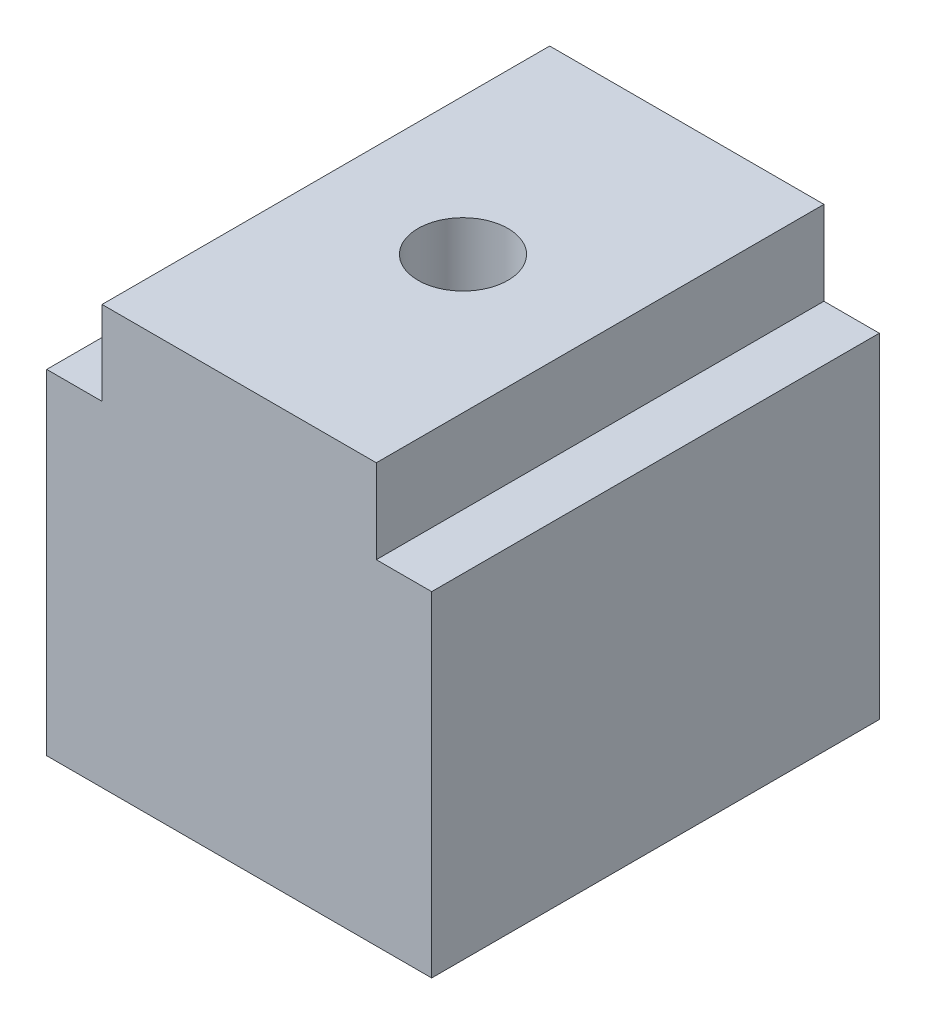
ISO-10303-21;
HEADER;
FILE_DESCRIPTION(('STEP AP214'),'2;1');
FILE_NAME('part.step','',(''),(''),'','','');
FILE_SCHEMA(('AUTOMOTIVE_DESIGN { 1 0 10303 214 1 1 1 1 }'));
ENDSEC;
DATA;
#1=APPLICATION_CONTEXT('core data for automotive mechanical design processes');
#2=APPLICATION_PROTOCOL_DEFINITION('international standard','automotive_design',2000,#1);
#3=PRODUCT_CONTEXT('',#1,'mechanical');
#4=PRODUCT('Part','Part','',(#3));
#5=PRODUCT_RELATED_PRODUCT_CATEGORY('part','',(#4));
#6=PRODUCT_DEFINITION_FORMATION('','',#4);
#7=PRODUCT_DEFINITION_CONTEXT('part definition',#1,'design');
#8=PRODUCT_DEFINITION('design','',#6,#7);
#9=PRODUCT_DEFINITION_SHAPE('','',#8);
#10=(LENGTH_UNIT() NAMED_UNIT(*) SI_UNIT(.MILLI.,.METRE.));
#11=(NAMED_UNIT(*) PLANE_ANGLE_UNIT() SI_UNIT($,.RADIAN.));
#12=(NAMED_UNIT(*) SI_UNIT($,.STERADIAN.) SOLID_ANGLE_UNIT());
#13=UNCERTAINTY_MEASURE_WITH_UNIT(LENGTH_MEASURE(1.E-05),#10,'distance_accuracy_value','');
#14=(GEOMETRIC_REPRESENTATION_CONTEXT(3) GLOBAL_UNCERTAINTY_ASSIGNED_CONTEXT((#13)) GLOBAL_UNIT_ASSIGNED_CONTEXT((#10,
#11,#12)) REPRESENTATION_CONTEXT('',''));
#15=CARTESIAN_POINT('',(0.,0.,0.));
#16=DIRECTION('',(0.,0.,1.));
#17=DIRECTION('',(1.,0.,0.));
#18=AXIS2_PLACEMENT_3D('',#15,#16,#17);
#19=CARTESIAN_POINT('',(10.922,23.749,12.7));
#20=DIRECTION('',(-1.,0.,0.));
#21=DIRECTION('',(0.,0.,1.));
#22=AXIS2_PLACEMENT_3D('',#19,#20,#21);
#23=PLANE('',#22);
#24=DIRECTION('',(0.,-1.,0.));
#25=VECTOR('',#24,1.);
#26=CARTESIAN_POINT('',(10.922,23.749,-12.7));
#27=LINE('',#26,#25);
#28=CARTESIAN_POINT('',(10.922,18.9865,-12.7));
#29=VERTEX_POINT('',#28);
#30=CARTESIAN_POINT('',(10.922,0.,-12.7));
#31=VERTEX_POINT('',#30);
#32=EDGE_CURVE('E11',#29,#31,#27,.T.);
#33=ORIENTED_EDGE('',*,*,#32,.F.);
#34=DIRECTION('',(0.,0.,-1.));
#35=VECTOR('',#34,1.);
#36=CARTESIAN_POINT('',(10.922,18.9865,-12.7));
#37=LINE('',#36,#35);
#38=CARTESIAN_POINT('',(10.922,18.9865,12.7));
#39=VERTEX_POINT('',#38);
#40=EDGE_CURVE('E151',#39,#29,#37,.T.);
#41=ORIENTED_EDGE('',*,*,#40,.F.);
#42=DIRECTION('',(0.,-1.,0.));
#43=VECTOR('',#42,1.);
#44=CARTESIAN_POINT('',(10.922,23.749,12.7));
#45=LINE('',#44,#43);
#46=CARTESIAN_POINT('',(10.922,0.,12.7));
#47=VERTEX_POINT('',#46);
#48=EDGE_CURVE('E120',#39,#47,#45,.T.);
#49=ORIENTED_EDGE('',*,*,#48,.T.);
#50=DIRECTION('',(0.,0.,-1.));
#51=VECTOR('',#50,1.);
#52=CARTESIAN_POINT('',(10.922,0.,12.7));
#53=LINE('',#52,#51);
#54=EDGE_CURVE('E132',#47,#31,#53,.T.);
#55=ORIENTED_EDGE('',*,*,#54,.T.);
#56=EDGE_LOOP('',(#33,#41,#49,#55));
#57=FACE_BOUND('',#56,.T.);
#58=ADVANCED_FACE('F32',(#57),#23,.F.);
#59=CARTESIAN_POINT('',(-10.922,23.749,-12.7));
#60=DIRECTION('',(0.,0.,1.));
#61=DIRECTION('',(1.,0.,0.));
#62=AXIS2_PLACEMENT_3D('',#59,#60,#61);
#63=PLANE('',#62);
#64=DIRECTION('',(-1.,0.,0.));
#65=VECTOR('',#64,1.);
#66=CARTESIAN_POINT('',(-10.922,18.9865,-12.7));
#67=LINE('',#66,#65);
#68=CARTESIAN_POINT('',(-7.78108871360405,18.9865,-12.7));
#69=VERTEX_POINT('',#68);
#70=CARTESIAN_POINT('',(-10.922,18.9865,-12.7));
#71=VERTEX_POINT('',#70);
#72=EDGE_CURVE('E97',#69,#71,#67,.T.);
#73=ORIENTED_EDGE('',*,*,#72,.F.);
#74=DIRECTION('',(0.,1.,0.));
#75=VECTOR('',#74,1.);
#76=CARTESIAN_POINT('',(-7.78108871360405,18.9865,-12.7));
#77=LINE('',#76,#75);
#78=CARTESIAN_POINT('',(-7.78108871360405,23.749,-12.7));
#79=VERTEX_POINT('',#78);
#80=EDGE_CURVE('E152',#69,#79,#77,.T.);
#81=ORIENTED_EDGE('',*,*,#80,.T.);
#82=DIRECTION('',(-1.,0.,0.));
#83=VECTOR('',#82,1.);
#84=CARTESIAN_POINT('',(-10.922,23.749,-12.7));
#85=LINE('',#84,#83);
#86=CARTESIAN_POINT('',(7.78108871360405,23.749,-12.7));
#87=VERTEX_POINT('',#86);
#88=EDGE_CURVE('E128',#87,#79,#85,.T.);
#89=ORIENTED_EDGE('',*,*,#88,.F.);
#90=DIRECTION('',(0.,1.,0.));
#91=VECTOR('',#90,1.);
#92=CARTESIAN_POINT('',(7.78108871360405,18.9865,-12.7));
#93=LINE('',#92,#91);
#94=CARTESIAN_POINT('',(7.78108871360405,18.9865,-12.7));
#95=VERTEX_POINT('',#94);
#96=EDGE_CURVE('E54',#95,#87,#93,.T.);
#97=ORIENTED_EDGE('',*,*,#96,.F.);
#98=DIRECTION('',(-1.,0.,0.));
#99=VECTOR('',#98,1.);
#100=CARTESIAN_POINT('',(10.922,18.9865,-12.7));
#101=LINE('',#100,#99);
#102=EDGE_CURVE('E157',#29,#95,#101,.T.);
#103=ORIENTED_EDGE('',*,*,#102,.F.);
#104=ORIENTED_EDGE('',*,*,#32,.T.);
#105=DIRECTION('',(-1.,0.,0.));
#106=VECTOR('',#105,1.);
#107=CARTESIAN_POINT('',(-10.922,0.,-12.7));
#108=LINE('',#107,#106);
#109=CARTESIAN_POINT('',(-10.922,0.,-12.7));
#110=VERTEX_POINT('',#109);
#111=EDGE_CURVE('E118',#31,#110,#108,.T.);
#112=ORIENTED_EDGE('',*,*,#111,.T.);
#113=DIRECTION('',(0.,-1.,0.));
#114=VECTOR('',#113,1.);
#115=CARTESIAN_POINT('',(-10.922,23.749,-12.7));
#116=LINE('',#115,#114);
#117=EDGE_CURVE('E39',#71,#110,#116,.T.);
#118=ORIENTED_EDGE('',*,*,#117,.F.);
#119=EDGE_LOOP('',(#73,#81,#89,#97,#103,#104,#112,#118));
#120=FACE_BOUND('',#119,.T.);
#121=ADVANCED_FACE('F116',(#120),#63,.F.);
#122=CARTESIAN_POINT('',(-10.922,23.749,12.7));
#123=DIRECTION('',(1.,0.,0.));
#124=DIRECTION('',(0.,0.,-1.));
#125=AXIS2_PLACEMENT_3D('',#122,#123,#124);
#126=PLANE('',#125);
#127=DIRECTION('',(0.,-1.,0.));
#128=VECTOR('',#127,1.);
#129=CARTESIAN_POINT('',(-10.922,23.749,12.7));
#130=LINE('',#129,#128);
#131=CARTESIAN_POINT('',(-10.922,18.9865,12.7));
#132=VERTEX_POINT('',#131);
#133=CARTESIAN_POINT('',(-10.922,0.,12.7));
#134=VERTEX_POINT('',#133);
#135=EDGE_CURVE('E113',#132,#134,#130,.T.);
#136=ORIENTED_EDGE('',*,*,#135,.F.);
#137=DIRECTION('',(0.,0.,1.));
#138=VECTOR('',#137,1.);
#139=CARTESIAN_POINT('',(-10.922,18.9865,-12.7));
#140=LINE('',#139,#138);
#141=EDGE_CURVE('E100',#71,#132,#140,.T.);
#142=ORIENTED_EDGE('',*,*,#141,.F.);
#143=ORIENTED_EDGE('',*,*,#117,.T.);
#144=DIRECTION('',(0.,0.,1.));
#145=VECTOR('',#144,1.);
#146=CARTESIAN_POINT('',(-10.922,0.,12.7));
#147=LINE('',#146,#145);
#148=EDGE_CURVE('E129',#110,#134,#147,.T.);
#149=ORIENTED_EDGE('',*,*,#148,.T.);
#150=EDGE_LOOP('',(#136,#142,#143,#149));
#151=FACE_BOUND('',#150,.T.);
#152=ADVANCED_FACE('F110',(#151),#126,.F.);
#153=CARTESIAN_POINT('',(-10.922,23.749,12.7));
#154=DIRECTION('',(0.,0.,-1.));
#155=DIRECTION('',(-1.,0.,0.));
#156=AXIS2_PLACEMENT_3D('',#153,#154,#155);
#157=PLANE('',#156);
#158=DIRECTION('',(1.,0.,0.));
#159=VECTOR('',#158,1.);
#160=CARTESIAN_POINT('',(-10.922,23.749,12.7));
#161=LINE('',#160,#159);
#162=CARTESIAN_POINT('',(-7.78108871360405,23.749,12.7));
#163=VERTEX_POINT('',#162);
#164=CARTESIAN_POINT('',(7.78108871360405,23.749,12.7));
#165=VERTEX_POINT('',#164);
#166=EDGE_CURVE('E124',#163,#165,#161,.T.);
#167=ORIENTED_EDGE('',*,*,#166,.F.);
#168=DIRECTION('',(0.,1.,0.));
#169=VECTOR('',#168,1.);
#170=CARTESIAN_POINT('',(-7.78108871360405,18.9865,12.7));
#171=LINE('',#170,#169);
#172=CARTESIAN_POINT('',(-7.78108871360405,18.9865,12.7));
#173=VERTEX_POINT('',#172);
#174=EDGE_CURVE('E46',#173,#163,#171,.T.);
#175=ORIENTED_EDGE('',*,*,#174,.F.);
#176=DIRECTION('',(1.,0.,0.));
#177=VECTOR('',#176,1.);
#178=CARTESIAN_POINT('',(-10.922,18.9865,12.7));
#179=LINE('',#178,#177);
#180=EDGE_CURVE('E114',#132,#173,#179,.T.);
#181=ORIENTED_EDGE('',*,*,#180,.F.);
#182=ORIENTED_EDGE('',*,*,#135,.T.);
#183=DIRECTION('',(1.,0.,0.));
#184=VECTOR('',#183,1.);
#185=CARTESIAN_POINT('',(-10.922,0.,12.7));
#186=LINE('',#185,#184);
#187=EDGE_CURVE('E125',#134,#47,#186,.T.);
#188=ORIENTED_EDGE('',*,*,#187,.T.);
#189=ORIENTED_EDGE('',*,*,#48,.F.);
#190=DIRECTION('',(1.,0.,0.));
#191=VECTOR('',#190,1.);
#192=CARTESIAN_POINT('',(10.922,18.9865,12.7));
#193=LINE('',#192,#191);
#194=CARTESIAN_POINT('',(7.78108871360405,18.9865,12.7));
#195=VERTEX_POINT('',#194);
#196=EDGE_CURVE('E146',#195,#39,#193,.T.);
#197=ORIENTED_EDGE('',*,*,#196,.F.);
#198=DIRECTION('',(0.,1.,0.));
#199=VECTOR('',#198,1.);
#200=CARTESIAN_POINT('',(7.78108871360405,18.9865,12.7));
#201=LINE('',#200,#199);
#202=EDGE_CURVE('E144',#195,#165,#201,.T.);
#203=ORIENTED_EDGE('',*,*,#202,.T.);
#204=EDGE_LOOP('',(#167,#175,#181,#182,#188,#189,#197,#203));
#205=FACE_BOUND('',#204,.T.);
#206=ADVANCED_FACE('F168',(#205),#157,.F.);
#207=CARTESIAN_POINT('',(0.,23.749,0.));
#208=DIRECTION('',(0.,-1.,0.));
#209=DIRECTION('',(0.,0.,-1.));
#210=AXIS2_PLACEMENT_3D('',#207,#208,#209);
#211=PLANE('',#210);
#212=CARTESIAN_POINT('',(0.,23.749,0.));
#213=DIRECTION('',(0.,1.,0.));
#214=DIRECTION('',(0.,0.,1.));
#215=AXIS2_PLACEMENT_3D('',#212,#213,#214);
#216=CIRCLE('',#215,2.5527);
#217=CARTESIAN_POINT('',(0.,23.749,2.5527));
#218=VERTEX_POINT('',#217);
#219=EDGE_CURVE('E141',#218,#218,#216,.T.);
#220=ORIENTED_EDGE('',*,*,#219,.F.);
#221=EDGE_LOOP('',(#220));
#222=FACE_BOUND('',#221,.T.);
#223=ORIENTED_EDGE('',*,*,#88,.T.);
#224=DIRECTION('',(0.,0.,-1.));
#225=VECTOR('',#224,1.);
#226=CARTESIAN_POINT('',(-7.78108871360405,23.749,-12.7));
#227=LINE('',#226,#225);
#228=EDGE_CURVE('E106',#163,#79,#227,.T.);
#229=ORIENTED_EDGE('',*,*,#228,.F.);
#230=ORIENTED_EDGE('',*,*,#166,.T.);
#231=DIRECTION('',(0.,0.,1.));
#232=VECTOR('',#231,1.);
#233=CARTESIAN_POINT('',(7.78108871360405,23.749,-12.7));
#234=LINE('',#233,#232);
#235=EDGE_CURVE('E149',#87,#165,#234,.T.);
#236=ORIENTED_EDGE('',*,*,#235,.F.);
#237=EDGE_LOOP('',(#223,#229,#230,#236));
#238=FACE_BOUND('',#237,.T.);
#239=ADVANCED_FACE('F171',(#222,#238),#211,.F.);
#240=CARTESIAN_POINT('',(0.,0.,0.));
#241=DIRECTION('',(0.,-1.,0.));
#242=DIRECTION('',(0.,0.,-1.));
#243=AXIS2_PLACEMENT_3D('',#240,#241,#242);
#244=PLANE('',#243);
#245=CARTESIAN_POINT('',(0.,0.,0.));
#246=DIRECTION('',(0.,1.,0.));
#247=DIRECTION('',(0.,0.,1.));
#248=AXIS2_PLACEMENT_3D('',#245,#246,#247);
#249=CIRCLE('',#248,2.5527);
#250=CARTESIAN_POINT('',(0.,0.,2.5527));
#251=VERTEX_POINT('',#250);
#252=EDGE_CURVE('E135',#251,#251,#249,.T.);
#253=ORIENTED_EDGE('',*,*,#252,.T.);
#254=EDGE_LOOP('',(#253));
#255=FACE_BOUND('',#254,.T.);
#256=ORIENTED_EDGE('',*,*,#54,.F.);
#257=ORIENTED_EDGE('',*,*,#187,.F.);
#258=ORIENTED_EDGE('',*,*,#148,.F.);
#259=ORIENTED_EDGE('',*,*,#111,.F.);
#260=EDGE_LOOP('',(#256,#257,#258,#259));
#261=FACE_BOUND('',#260,.T.);
#262=ADVANCED_FACE('F184',(#255,#261),#244,.T.);
#263=CARTESIAN_POINT('',(0.,23.749,0.));
#264=DIRECTION('',(0.,1.,0.));
#265=DIRECTION('',(0.,0.,1.));
#266=AXIS2_PLACEMENT_3D('',#263,#264,#265);
#267=CYLINDRICAL_SURFACE('',#266,2.5527);
#268=ORIENTED_EDGE('',*,*,#252,.F.);
#269=EDGE_LOOP('',(#268));
#270=FACE_BOUND('',#269,.T.);
#271=ORIENTED_EDGE('',*,*,#219,.T.);
#272=EDGE_LOOP('',(#271));
#273=FACE_BOUND('',#272,.T.);
#274=ADVANCED_FACE('F186',(#270,#273),#267,.F.);
#275=CARTESIAN_POINT('',(7.78108871360405,18.9865,-12.7));
#276=DIRECTION('',(-1.,0.,0.));
#277=DIRECTION('',(0.,0.,1.));
#278=AXIS2_PLACEMENT_3D('',#275,#276,#277);
#279=PLANE('',#278);
#280=ORIENTED_EDGE('',*,*,#235,.T.);
#281=ORIENTED_EDGE('',*,*,#202,.F.);
#282=DIRECTION('',(0.,0.,1.));
#283=VECTOR('',#282,1.);
#284=CARTESIAN_POINT('',(7.78108871360405,18.9865,-12.7));
#285=LINE('',#284,#283);
#286=EDGE_CURVE('E154',#95,#195,#285,.T.);
#287=ORIENTED_EDGE('',*,*,#286,.F.);
#288=ORIENTED_EDGE('',*,*,#96,.T.);
#289=EDGE_LOOP('',(#280,#281,#287,#288));
#290=FACE_BOUND('',#289,.T.);
#291=ADVANCED_FACE('F173',(#290),#279,.F.);
#292=CARTESIAN_POINT('',(0.,18.9865,0.));
#293=DIRECTION('',(0.,-1.,0.));
#294=DIRECTION('',(0.,0.,-1.));
#295=AXIS2_PLACEMENT_3D('',#292,#293,#294);
#296=PLANE('',#295);
#297=ORIENTED_EDGE('',*,*,#40,.T.);
#298=ORIENTED_EDGE('',*,*,#102,.T.);
#299=ORIENTED_EDGE('',*,*,#286,.T.);
#300=ORIENTED_EDGE('',*,*,#196,.T.);
#301=EDGE_LOOP('',(#297,#298,#299,#300));
#302=FACE_BOUND('',#301,.T.);
#303=ADVANCED_FACE('F175',(#302),#296,.F.);
#304=CARTESIAN_POINT('',(-7.78108871360405,18.9865,-12.7));
#305=DIRECTION('',(1.,0.,0.));
#306=DIRECTION('',(0.,0.,-1.));
#307=AXIS2_PLACEMENT_3D('',#304,#305,#306);
#308=PLANE('',#307);
#309=ORIENTED_EDGE('',*,*,#228,.T.);
#310=ORIENTED_EDGE('',*,*,#80,.F.);
#311=DIRECTION('',(0.,0.,-1.));
#312=VECTOR('',#311,1.);
#313=CARTESIAN_POINT('',(-7.78108871360405,18.9865,-12.7));
#314=LINE('',#313,#312);
#315=EDGE_CURVE('E102',#173,#69,#314,.T.);
#316=ORIENTED_EDGE('',*,*,#315,.F.);
#317=ORIENTED_EDGE('',*,*,#174,.T.);
#318=EDGE_LOOP('',(#309,#310,#316,#317));
#319=FACE_BOUND('',#318,.T.);
#320=ADVANCED_FACE('F166',(#319),#308,.F.);
#321=CARTESIAN_POINT('',(0.,18.9865,0.));
#322=DIRECTION('',(0.,-1.,0.));
#323=DIRECTION('',(0.,0.,-1.));
#324=AXIS2_PLACEMENT_3D('',#321,#322,#323);
#325=PLANE('',#324);
#326=ORIENTED_EDGE('',*,*,#72,.T.);
#327=ORIENTED_EDGE('',*,*,#141,.T.);
#328=ORIENTED_EDGE('',*,*,#180,.T.);
#329=ORIENTED_EDGE('',*,*,#315,.T.);
#330=EDGE_LOOP('',(#326,#327,#328,#329));
#331=FACE_BOUND('',#330,.T.);
#332=ADVANCED_FACE('F99',(#331),#325,.F.);
#333=CLOSED_SHELL('',(#58,#121,#152,#206,#239,#262,#274,#291,#303,#320,#332));
#334=MANIFOLD_SOLID_BREP('B2',#333);
#335=ADVANCED_BREP_SHAPE_REPRESENTATION('',(#18,#334),#14);
#336=SHAPE_DEFINITION_REPRESENTATION(#9,#335);
ENDSEC;
END-ISO-10303-21;
